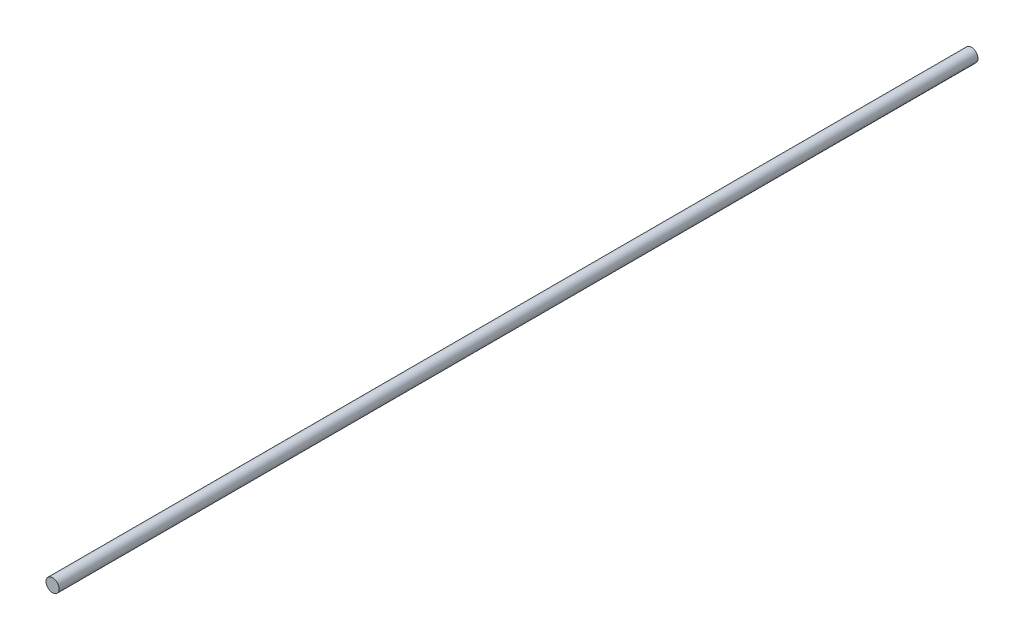
ISO-10303-21;
HEADER;
FILE_DESCRIPTION(('STEP AP214'),'2;1');
FILE_NAME('part.step','',(''),(''),'','','');
FILE_SCHEMA(('AUTOMOTIVE_DESIGN { 1 0 10303 214 1 1 1 1 }'));
ENDSEC;
DATA;
#1=APPLICATION_CONTEXT('core data for automotive mechanical design processes');
#2=APPLICATION_PROTOCOL_DEFINITION('international standard','automotive_design',2000,#1);
#3=PRODUCT_CONTEXT('',#1,'mechanical');
#4=PRODUCT('Part','Part','',(#3));
#5=PRODUCT_RELATED_PRODUCT_CATEGORY('part','',(#4));
#6=PRODUCT_DEFINITION_FORMATION('','',#4);
#7=PRODUCT_DEFINITION_CONTEXT('part definition',#1,'design');
#8=PRODUCT_DEFINITION('design','',#6,#7);
#9=PRODUCT_DEFINITION_SHAPE('','',#8);
#10=(LENGTH_UNIT() NAMED_UNIT(*) SI_UNIT(.MILLI.,.METRE.));
#11=(NAMED_UNIT(*) PLANE_ANGLE_UNIT() SI_UNIT($,.RADIAN.));
#12=(NAMED_UNIT(*) SI_UNIT($,.STERADIAN.) SOLID_ANGLE_UNIT());
#13=UNCERTAINTY_MEASURE_WITH_UNIT(LENGTH_MEASURE(1.E-05),#10,'distance_accuracy_value','');
#14=(GEOMETRIC_REPRESENTATION_CONTEXT(3) GLOBAL_UNCERTAINTY_ASSIGNED_CONTEXT((#13)) GLOBAL_UNIT_ASSIGNED_CONTEXT((#10,
#11,#12)) REPRESENTATION_CONTEXT('',''));
#15=CARTESIAN_POINT('',(0.,0.,0.));
#16=DIRECTION('',(0.,0.,1.));
#17=DIRECTION('',(1.,0.,0.));
#18=AXIS2_PLACEMENT_3D('',#15,#16,#17);
#19=CARTESIAN_POINT('',(0.,0.,280.));
#20=DIRECTION('',(0.,0.,-1.));
#21=DIRECTION('',(-1.,0.,0.));
#22=AXIS2_PLACEMENT_3D('',#19,#20,#21);
#23=CYLINDRICAL_SURFACE('',#22,2.);
#24=CARTESIAN_POINT('',(0.,0.,280.));
#25=DIRECTION('',(0.,0.,1.));
#26=DIRECTION('',(1.,0.,0.));
#27=AXIS2_PLACEMENT_3D('',#24,#25,#26);
#28=CIRCLE('',#27,2.);
#29=CARTESIAN_POINT('',(2.,0.,280.));
#30=VERTEX_POINT('',#29);
#31=EDGE_CURVE('E10',#30,#30,#28,.T.);
#32=ORIENTED_EDGE('',*,*,#31,.F.);
#33=EDGE_LOOP('',(#32));
#34=FACE_BOUND('',#33,.T.);
#35=CARTESIAN_POINT('',(0.,0.,0.));
#36=DIRECTION('',(0.,0.,1.));
#37=DIRECTION('',(1.,0.,0.));
#38=AXIS2_PLACEMENT_3D('',#35,#36,#37);
#39=CIRCLE('',#38,2.);
#40=CARTESIAN_POINT('',(2.,0.,0.));
#41=VERTEX_POINT('',#40);
#42=EDGE_CURVE('E34',#41,#41,#39,.T.);
#43=ORIENTED_EDGE('',*,*,#42,.T.);
#44=EDGE_LOOP('',(#43));
#45=FACE_BOUND('',#44,.T.);
#46=ADVANCED_FACE('F31',(#34,#45),#23,.T.);
#47=CARTESIAN_POINT('',(0.,0.,280.));
#48=DIRECTION('',(0.,0.,1.));
#49=DIRECTION('',(1.,0.,0.));
#50=AXIS2_PLACEMENT_3D('',#47,#48,#49);
#51=PLANE('',#50);
#52=ORIENTED_EDGE('',*,*,#31,.T.);
#53=EDGE_LOOP('',(#52));
#54=FACE_BOUND('',#53,.T.);
#55=ADVANCED_FACE('F46',(#54),#51,.T.);
#56=CARTESIAN_POINT('',(0.,0.,0.));
#57=DIRECTION('',(0.,0.,1.));
#58=DIRECTION('',(1.,0.,0.));
#59=AXIS2_PLACEMENT_3D('',#56,#57,#58);
#60=PLANE('',#59);
#61=ORIENTED_EDGE('',*,*,#42,.F.);
#62=EDGE_LOOP('',(#61));
#63=FACE_BOUND('',#62,.T.);
#64=ADVANCED_FACE('F44',(#63),#60,.F.);
#65=CLOSED_SHELL('',(#46,#55,#64));
#66=MANIFOLD_SOLID_BREP('B2',#65);
#67=ADVANCED_BREP_SHAPE_REPRESENTATION('',(#18,#66),#14);
#68=SHAPE_DEFINITION_REPRESENTATION(#9,#67);
ENDSEC;
END-ISO-10303-21;
